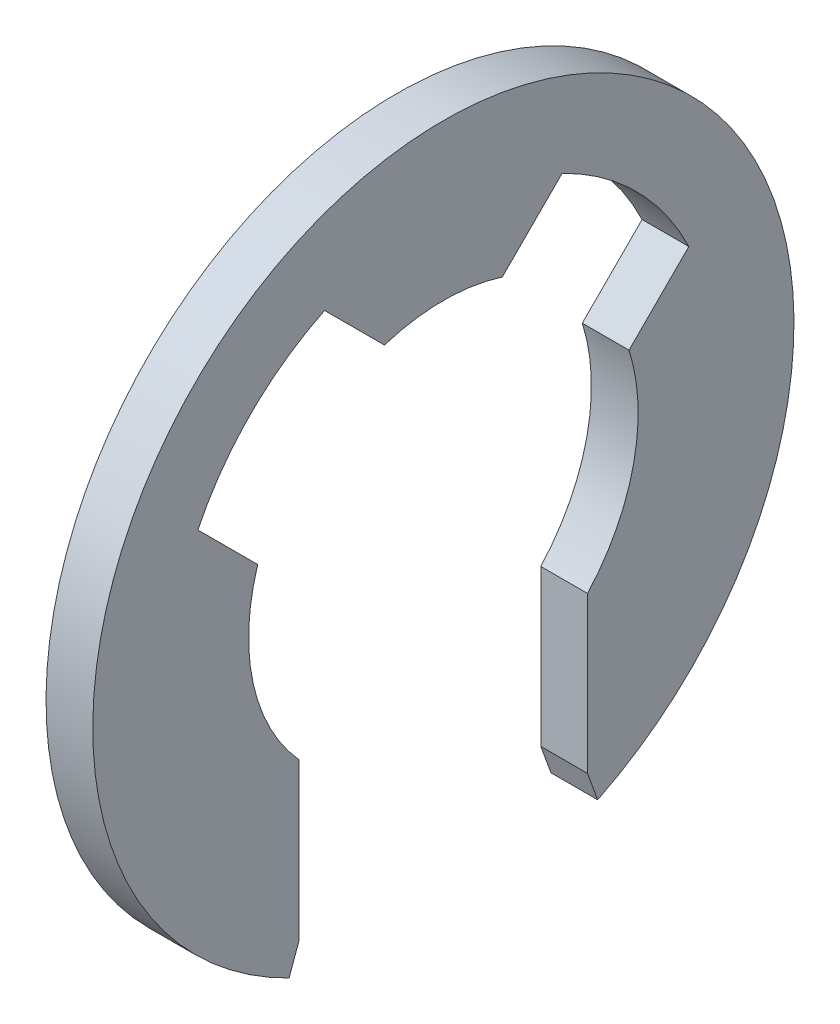
ISO-10303-21;
HEADER;
FILE_DESCRIPTION(('STEP AP214'),'2;1');
FILE_NAME('part.step','',(''),(''),'','','');
FILE_SCHEMA(('AUTOMOTIVE_DESIGN { 1 0 10303 214 1 1 1 1 }'));
ENDSEC;
DATA;
#1=APPLICATION_CONTEXT('core data for automotive mechanical design processes');
#2=APPLICATION_PROTOCOL_DEFINITION('international standard','automotive_design',2000,#1);
#3=PRODUCT_CONTEXT('',#1,'mechanical');
#4=PRODUCT('Part','Part','',(#3));
#5=PRODUCT_RELATED_PRODUCT_CATEGORY('part','',(#4));
#6=PRODUCT_DEFINITION_FORMATION('','',#4);
#7=PRODUCT_DEFINITION_CONTEXT('part definition',#1,'design');
#8=PRODUCT_DEFINITION('design','',#6,#7);
#9=PRODUCT_DEFINITION_SHAPE('','',#8);
#10=(LENGTH_UNIT() NAMED_UNIT(*) SI_UNIT(.MILLI.,.METRE.));
#11=(NAMED_UNIT(*) PLANE_ANGLE_UNIT() SI_UNIT($,.RADIAN.));
#12=(NAMED_UNIT(*) SI_UNIT($,.STERADIAN.) SOLID_ANGLE_UNIT());
#13=UNCERTAINTY_MEASURE_WITH_UNIT(LENGTH_MEASURE(1.E-05),#10,'distance_accuracy_value','');
#14=(GEOMETRIC_REPRESENTATION_CONTEXT(3) GLOBAL_UNCERTAINTY_ASSIGNED_CONTEXT((#13)) GLOBAL_UNIT_ASSIGNED_CONTEXT((#10,
#11,#12)) REPRESENTATION_CONTEXT('',''));
#15=CARTESIAN_POINT('',(0.,0.,0.));
#16=DIRECTION('',(0.,0.,1.));
#17=DIRECTION('',(1.,0.,0.));
#18=AXIS2_PLACEMENT_3D('',#15,#16,#17);
#19=CARTESIAN_POINT('',(0.6,0.,0.));
#20=DIRECTION('',(-1.,0.,0.));
#21=DIRECTION('',(0.,0.,1.));
#22=AXIS2_PLACEMENT_3D('',#19,#20,#21);
#23=CYLINDRICAL_SURFACE('',#22,4.5);
#24=CARTESIAN_POINT('',(0.6,0.,0.));
#25=DIRECTION('',(1.,0.,0.));
#26=DIRECTION('',(0.,0.,-1.));
#27=AXIS2_PLACEMENT_3D('',#24,#25,#26);
#28=CIRCLE('',#27,4.5);
#29=CARTESIAN_POINT('',(0.6,-4.04064170194528,-1.9807106392658));
#30=VERTEX_POINT('',#29);
#31=CARTESIAN_POINT('',(0.6,-4.04064170194528,1.9807106392658));
#32=VERTEX_POINT('',#31);
#33=EDGE_CURVE('E11',#30,#32,#28,.T.);
#34=ORIENTED_EDGE('',*,*,#33,.F.);
#35=DIRECTION('',(1.,0.,0.));
#36=VECTOR('',#35,1.);
#37=CARTESIAN_POINT('',(0.,-4.04064170194528,-1.9807106392658));
#38=LINE('',#37,#36);
#39=CARTESIAN_POINT('',(0.,-4.04064170194528,-1.9807106392658));
#40=VERTEX_POINT('',#39);
#41=EDGE_CURVE('E216',#40,#30,#38,.T.);
#42=ORIENTED_EDGE('',*,*,#41,.F.);
#43=CARTESIAN_POINT('',(0.,0.,0.));
#44=DIRECTION('',(1.,0.,0.));
#45=DIRECTION('',(0.,0.,-1.));
#46=AXIS2_PLACEMENT_3D('',#43,#44,#45);
#47=CIRCLE('',#46,4.5);
#48=CARTESIAN_POINT('',(0.,-4.04064170194528,1.9807106392658));
#49=VERTEX_POINT('',#48);
#50=EDGE_CURVE('E33',#40,#49,#47,.T.);
#51=ORIENTED_EDGE('',*,*,#50,.T.);
#52=DIRECTION('',(1.,0.,0.));
#53=VECTOR('',#52,1.);
#54=CARTESIAN_POINT('',(0.,-4.04064170194528,1.9807106392658));
#55=LINE('',#54,#53);
#56=EDGE_CURVE('E218',#49,#32,#55,.T.);
#57=ORIENTED_EDGE('',*,*,#56,.T.);
#58=EDGE_LOOP('',(#34,#42,#51,#57));
#59=FACE_BOUND('',#58,.T.);
#60=ADVANCED_FACE('F30',(#59),#23,.T.);
#61=CARTESIAN_POINT('',(0.6,0.,0.));
#62=DIRECTION('',(1.,0.,0.));
#63=DIRECTION('',(0.,0.,-1.));
#64=AXIS2_PLACEMENT_3D('',#61,#62,#63);
#65=PLANE('',#64);
#66=DIRECTION('',(0.,0.939692620785908,0.342020143325671));
#67=VECTOR('',#66,1.);
#68=CARTESIAN_POINT('',(0.6,-3.68151717208002,-1.85));
#69=LINE('',#68,#67);
#70=CARTESIAN_POINT('',(0.6,-3.68151717208002,-1.85));
#71=VERTEX_POINT('',#70);
#72=EDGE_CURVE('E174',#30,#71,#69,.T.);
#73=ORIENTED_EDGE('',*,*,#72,.F.);
#74=ORIENTED_EDGE('',*,*,#33,.T.);
#75=DIRECTION('',(0.,-0.939692620785907,0.342020143325673));
#76=VECTOR('',#75,1.);
#77=CARTESIAN_POINT('',(0.6,-3.68151717208002,1.85));
#78=LINE('',#77,#76);
#79=CARTESIAN_POINT('',(0.6,-3.68151717208002,1.85));
#80=VERTEX_POINT('',#79);
#81=EDGE_CURVE('E172',#80,#32,#78,.T.);
#82=ORIENTED_EDGE('',*,*,#81,.F.);
#83=DIRECTION('',(0.,-1.,0.));
#84=VECTOR('',#83,1.);
#85=CARTESIAN_POINT('',(0.6,-1.68151717208002,1.85));
#86=LINE('',#85,#84);
#87=CARTESIAN_POINT('',(0.6,-1.68151717208002,1.85));
#88=VERTEX_POINT('',#87);
#89=EDGE_CURVE('E169',#88,#80,#86,.T.);
#90=ORIENTED_EDGE('',*,*,#89,.F.);
#91=CARTESIAN_POINT('',(0.6,0.,0.));
#92=DIRECTION('',(1.,0.,0.));
#93=DIRECTION('',(0.,0.,-1.));
#94=AXIS2_PLACEMENT_3D('',#91,#92,#93);
#95=CIRCLE('',#94,2.5);
#96=CARTESIAN_POINT('',(0.6,0.75646091686971,2.38280651359875));
#97=VERTEX_POINT('',#96);
#98=EDGE_CURVE('E167',#97,#88,#95,.T.);
#99=ORIENTED_EDGE('',*,*,#98,.F.);
#100=DIRECTION('',(0.,-0.707106781186551,-0.707106781186545));
#101=VECTOR('',#100,1.);
#102=CARTESIAN_POINT('',(0.6,0.75646091686971,2.38280651359875));
#103=LINE('',#102,#101);
#104=CARTESIAN_POINT('',(0.6,1.52429377893665,3.15063937566568));
#105=VERTEX_POINT('',#104);
#106=EDGE_CURVE('E198',#105,#97,#103,.T.);
#107=ORIENTED_EDGE('',*,*,#106,.F.);
#108=CARTESIAN_POINT('',(0.6,0.,0.));
#109=DIRECTION('',(1.,0.,0.));
#110=DIRECTION('',(0.,0.,-1.));
#111=AXIS2_PLACEMENT_3D('',#108,#109,#110);
#112=CIRCLE('',#111,3.5);
#113=CARTESIAN_POINT('',(0.6,3.1506393756657,1.52429377893661));
#114=VERTEX_POINT('',#113);
#115=EDGE_CURVE('E196',#114,#105,#112,.T.);
#116=ORIENTED_EDGE('',*,*,#115,.F.);
#117=DIRECTION('',(0.,0.707106781186552,0.707106781186543));
#118=VECTOR('',#117,1.);
#119=CARTESIAN_POINT('',(0.6,2.38280651359876,0.756460916869684));
#120=LINE('',#119,#118);
#121=CARTESIAN_POINT('',(0.6,2.38280651359876,0.756460916869684));
#122=VERTEX_POINT('',#121);
#123=EDGE_CURVE('E142',#122,#114,#120,.T.);
#124=ORIENTED_EDGE('',*,*,#123,.F.);
#125=CARTESIAN_POINT('',(0.6,0.,0.));
#126=DIRECTION('',(1.,0.,0.));
#127=DIRECTION('',(0.,0.,-1.));
#128=AXIS2_PLACEMENT_3D('',#125,#126,#127);
#129=CIRCLE('',#128,2.5);
#130=CARTESIAN_POINT('',(0.6,2.38280651359876,-0.756460916869684));
#131=VERTEX_POINT('',#130);
#132=EDGE_CURVE('E192',#131,#122,#129,.T.);
#133=ORIENTED_EDGE('',*,*,#132,.F.);
#134=DIRECTION('',(0.,-0.707106781186553,0.707106781186543));
#135=VECTOR('',#134,1.);
#136=CARTESIAN_POINT('',(0.6,2.38280651359876,-0.756460916869684));
#137=LINE('',#136,#135);
#138=CARTESIAN_POINT('',(0.6,3.1506393756657,-1.52429377893661));
#139=VERTEX_POINT('',#138);
#140=EDGE_CURVE('E189',#139,#131,#137,.T.);
#141=ORIENTED_EDGE('',*,*,#140,.F.);
#142=CARTESIAN_POINT('',(0.6,0.,0.));
#143=DIRECTION('',(1.,0.,0.));
#144=DIRECTION('',(0.,0.,-1.));
#145=AXIS2_PLACEMENT_3D('',#142,#143,#144);
#146=CIRCLE('',#145,3.5);
#147=CARTESIAN_POINT('',(0.6,1.52429377893665,-3.15063937566568));
#148=VERTEX_POINT('',#147);
#149=EDGE_CURVE('E186',#148,#139,#146,.T.);
#150=ORIENTED_EDGE('',*,*,#149,.F.);
#151=DIRECTION('',(0.,0.707106781186551,-0.707106781186544));
#152=VECTOR('',#151,1.);
#153=CARTESIAN_POINT('',(0.6,0.75646091686971,-2.38280651359875));
#154=LINE('',#153,#152);
#155=CARTESIAN_POINT('',(0.6,0.75646091686971,-2.38280651359875));
#156=VERTEX_POINT('',#155);
#157=EDGE_CURVE('E183',#156,#148,#154,.T.);
#158=ORIENTED_EDGE('',*,*,#157,.F.);
#159=CARTESIAN_POINT('',(0.6,0.,0.));
#160=DIRECTION('',(1.,0.,0.));
#161=DIRECTION('',(0.,0.,-1.));
#162=AXIS2_PLACEMENT_3D('',#159,#160,#161);
#163=CIRCLE('',#162,2.5);
#164=CARTESIAN_POINT('',(0.6,-1.68151717208002,-1.85));
#165=VERTEX_POINT('',#164);
#166=EDGE_CURVE('E180',#165,#156,#163,.T.);
#167=ORIENTED_EDGE('',*,*,#166,.F.);
#168=DIRECTION('',(0.,1.,0.));
#169=VECTOR('',#168,1.);
#170=CARTESIAN_POINT('',(0.6,-1.68151717208002,-1.85));
#171=LINE('',#170,#169);
#172=EDGE_CURVE('E177',#71,#165,#171,.T.);
#173=ORIENTED_EDGE('',*,*,#172,.F.);
#174=EDGE_LOOP('',(#73,#74,#82,#90,#99,#107,#116,#124,#133,#141,#150,#158,#167,#173));
#175=FACE_BOUND('',#174,.T.);
#176=ADVANCED_FACE('F235',(#175),#65,.T.);
#177=CARTESIAN_POINT('',(0.,0.,0.));
#178=DIRECTION('',(1.,0.,0.));
#179=DIRECTION('',(0.,0.,-1.));
#180=AXIS2_PLACEMENT_3D('',#177,#178,#179);
#181=PLANE('',#180);
#182=ORIENTED_EDGE('',*,*,#50,.F.);
#183=DIRECTION('',(0.,0.939692620785908,0.342020143325671));
#184=VECTOR('',#183,1.);
#185=CARTESIAN_POINT('',(0.,-3.68151717208002,-1.85));
#186=LINE('',#185,#184);
#187=CARTESIAN_POINT('',(0.,-3.68151717208002,-1.85));
#188=VERTEX_POINT('',#187);
#189=EDGE_CURVE('E243',#40,#188,#186,.T.);
#190=ORIENTED_EDGE('',*,*,#189,.T.);
#191=DIRECTION('',(0.,1.,0.));
#192=VECTOR('',#191,1.);
#193=CARTESIAN_POINT('',(0.,-1.68151717208002,-1.85));
#194=LINE('',#193,#192);
#195=CARTESIAN_POINT('',(0.,-1.68151717208002,-1.85));
#196=VERTEX_POINT('',#195);
#197=EDGE_CURVE('E245',#188,#196,#194,.T.);
#198=ORIENTED_EDGE('',*,*,#197,.T.);
#199=CARTESIAN_POINT('',(0.,0.,0.));
#200=DIRECTION('',(1.,0.,0.));
#201=DIRECTION('',(0.,0.,-1.));
#202=AXIS2_PLACEMENT_3D('',#199,#200,#201);
#203=CIRCLE('',#202,2.5);
#204=CARTESIAN_POINT('',(0.,0.75646091686971,-2.38280651359875));
#205=VERTEX_POINT('',#204);
#206=EDGE_CURVE('E251',#196,#205,#203,.T.);
#207=ORIENTED_EDGE('',*,*,#206,.T.);
#208=DIRECTION('',(0.,0.707106781186551,-0.707106781186544));
#209=VECTOR('',#208,1.);
#210=CARTESIAN_POINT('',(0.,0.75646091686971,-2.38280651359875));
#211=LINE('',#210,#209);
#212=CARTESIAN_POINT('',(0.,1.52429377893665,-3.15063937566568));
#213=VERTEX_POINT('',#212);
#214=EDGE_CURVE('E254',#205,#213,#211,.T.);
#215=ORIENTED_EDGE('',*,*,#214,.T.);
#216=CARTESIAN_POINT('',(0.,0.,0.));
#217=DIRECTION('',(1.,0.,0.));
#218=DIRECTION('',(0.,0.,-1.));
#219=AXIS2_PLACEMENT_3D('',#216,#217,#218);
#220=CIRCLE('',#219,3.5);
#221=CARTESIAN_POINT('',(0.,3.1506393756657,-1.52429377893661));
#222=VERTEX_POINT('',#221);
#223=EDGE_CURVE('E257',#213,#222,#220,.T.);
#224=ORIENTED_EDGE('',*,*,#223,.T.);
#225=DIRECTION('',(0.,-0.707106781186553,0.707106781186543));
#226=VECTOR('',#225,1.);
#227=CARTESIAN_POINT('',(0.,2.38280651359876,-0.756460916869684));
#228=LINE('',#227,#226);
#229=CARTESIAN_POINT('',(0.,2.38280651359876,-0.756460916869684));
#230=VERTEX_POINT('',#229);
#231=EDGE_CURVE('E162',#222,#230,#228,.T.);
#232=ORIENTED_EDGE('',*,*,#231,.T.);
#233=CARTESIAN_POINT('',(0.,0.,0.));
#234=DIRECTION('',(1.,0.,0.));
#235=DIRECTION('',(0.,0.,-1.));
#236=AXIS2_PLACEMENT_3D('',#233,#234,#235);
#237=CIRCLE('',#236,2.5);
#238=CARTESIAN_POINT('',(0.,2.38280651359876,0.756460916869684));
#239=VERTEX_POINT('',#238);
#240=EDGE_CURVE('E160',#230,#239,#237,.T.);
#241=ORIENTED_EDGE('',*,*,#240,.T.);
#242=DIRECTION('',(0.,0.707106781186552,0.707106781186543));
#243=VECTOR('',#242,1.);
#244=CARTESIAN_POINT('',(0.,2.38280651359876,0.756460916869684));
#245=LINE('',#244,#243);
#246=CARTESIAN_POINT('',(0.,3.1506393756657,1.52429377893661));
#247=VERTEX_POINT('',#246);
#248=EDGE_CURVE('E139',#239,#247,#245,.T.);
#249=ORIENTED_EDGE('',*,*,#248,.T.);
#250=CARTESIAN_POINT('',(0.,0.,0.));
#251=DIRECTION('',(1.,0.,0.));
#252=DIRECTION('',(0.,0.,-1.));
#253=AXIS2_PLACEMENT_3D('',#250,#251,#252);
#254=CIRCLE('',#253,3.5);
#255=CARTESIAN_POINT('',(0.,1.52429377893665,3.15063937566568));
#256=VERTEX_POINT('',#255);
#257=EDGE_CURVE('E150',#247,#256,#254,.T.);
#258=ORIENTED_EDGE('',*,*,#257,.T.);
#259=DIRECTION('',(0.,-0.707106781186551,-0.707106781186545));
#260=VECTOR('',#259,1.);
#261=CARTESIAN_POINT('',(0.,0.75646091686971,2.38280651359875));
#262=LINE('',#261,#260);
#263=CARTESIAN_POINT('',(0.,0.75646091686971,2.38280651359875));
#264=VERTEX_POINT('',#263);
#265=EDGE_CURVE('E154',#256,#264,#262,.T.);
#266=ORIENTED_EDGE('',*,*,#265,.T.);
#267=CARTESIAN_POINT('',(0.,0.,0.));
#268=DIRECTION('',(1.,0.,0.));
#269=DIRECTION('',(0.,0.,-1.));
#270=AXIS2_PLACEMENT_3D('',#267,#268,#269);
#271=CIRCLE('',#270,2.5);
#272=CARTESIAN_POINT('',(0.,-1.68151717208002,1.85));
#273=VERTEX_POINT('',#272);
#274=EDGE_CURVE('E200',#264,#273,#271,.T.);
#275=ORIENTED_EDGE('',*,*,#274,.T.);
#276=DIRECTION('',(0.,-1.,0.));
#277=VECTOR('',#276,1.);
#278=CARTESIAN_POINT('',(0.,-1.68151717208002,1.85));
#279=LINE('',#278,#277);
#280=CARTESIAN_POINT('',(0.,-3.68151717208002,1.85));
#281=VERTEX_POINT('',#280);
#282=EDGE_CURVE('E228',#273,#281,#279,.T.);
#283=ORIENTED_EDGE('',*,*,#282,.T.);
#284=DIRECTION('',(0.,-0.939692620785907,0.342020143325673));
#285=VECTOR('',#284,1.);
#286=CARTESIAN_POINT('',(0.,-3.68151717208002,1.85));
#287=LINE('',#286,#285);
#288=EDGE_CURVE('E44',#281,#49,#287,.T.);
#289=ORIENTED_EDGE('',*,*,#288,.T.);
#290=EDGE_LOOP('',(#182,#190,#198,#207,#215,#224,#232,#241,#249,#258,#266,#275,#283,#289));
#291=FACE_BOUND('',#290,.T.);
#292=ADVANCED_FACE('F157',(#291),#181,.F.);
#293=CARTESIAN_POINT('',(0.,0.,0.));
#294=DIRECTION('',(1.,0.,0.));
#295=DIRECTION('',(0.,0.,-1.));
#296=AXIS2_PLACEMENT_3D('',#293,#294,#295);
#297=CYLINDRICAL_SURFACE('',#296,2.5);
#298=ORIENTED_EDGE('',*,*,#98,.T.);
#299=DIRECTION('',(1.,0.,0.));
#300=VECTOR('',#299,1.);
#301=CARTESIAN_POINT('',(0.,-1.68151717208002,1.85));
#302=LINE('',#301,#300);
#303=EDGE_CURVE('E104',#273,#88,#302,.T.);
#304=ORIENTED_EDGE('',*,*,#303,.F.);
#305=ORIENTED_EDGE('',*,*,#274,.F.);
#306=DIRECTION('',(1.,0.,0.));
#307=VECTOR('',#306,1.);
#308=CARTESIAN_POINT('',(0.,0.75646091686971,2.38280651359875));
#309=LINE('',#308,#307);
#310=EDGE_CURVE('E53',#264,#97,#309,.T.);
#311=ORIENTED_EDGE('',*,*,#310,.T.);
#312=EDGE_LOOP('',(#298,#304,#305,#311));
#313=FACE_BOUND('',#312,.T.);
#314=ADVANCED_FACE('F231',(#313),#297,.F.);
#315=CARTESIAN_POINT('',(0.,0.75646091686971,2.38280651359875));
#316=DIRECTION('',(0.,-0.707106781186545,0.70710678118655));
#317=DIRECTION('',(0.,-0.70710678118655,-0.707106781186545));
#318=AXIS2_PLACEMENT_3D('',#315,#316,#317);
#319=PLANE('',#318);
#320=ORIENTED_EDGE('',*,*,#106,.T.);
#321=ORIENTED_EDGE('',*,*,#310,.F.);
#322=ORIENTED_EDGE('',*,*,#265,.F.);
#323=DIRECTION('',(1.,0.,0.));
#324=VECTOR('',#323,1.);
#325=CARTESIAN_POINT('',(0.,1.52429377893665,3.15063937566568));
#326=LINE('',#325,#324);
#327=EDGE_CURVE('E146',#256,#105,#326,.T.);
#328=ORIENTED_EDGE('',*,*,#327,.T.);
#329=EDGE_LOOP('',(#320,#321,#322,#328));
#330=FACE_BOUND('',#329,.T.);
#331=ADVANCED_FACE('F267',(#330),#319,.F.);
#332=CARTESIAN_POINT('',(0.,0.,0.));
#333=DIRECTION('',(1.,0.,0.));
#334=DIRECTION('',(0.,0.,-1.));
#335=AXIS2_PLACEMENT_3D('',#332,#333,#334);
#336=CYLINDRICAL_SURFACE('',#335,3.5);
#337=ORIENTED_EDGE('',*,*,#115,.T.);
#338=ORIENTED_EDGE('',*,*,#327,.F.);
#339=ORIENTED_EDGE('',*,*,#257,.F.);
#340=DIRECTION('',(1.,0.,0.));
#341=VECTOR('',#340,1.);
#342=CARTESIAN_POINT('',(0.,3.1506393756657,1.52429377893661));
#343=LINE('',#342,#341);
#344=EDGE_CURVE('E135',#247,#114,#343,.T.);
#345=ORIENTED_EDGE('',*,*,#344,.T.);
#346=EDGE_LOOP('',(#337,#338,#339,#345));
#347=FACE_BOUND('',#346,.T.);
#348=ADVANCED_FACE('F151',(#347),#336,.F.);
#349=CARTESIAN_POINT('',(0.,2.38280651359876,0.756460916869684));
#350=DIRECTION('',(0.,0.707106781186543,-0.707106781186552));
#351=DIRECTION('',(0.,0.707106781186552,0.707106781186543));
#352=AXIS2_PLACEMENT_3D('',#349,#350,#351);
#353=PLANE('',#352);
#354=ORIENTED_EDGE('',*,*,#123,.T.);
#355=ORIENTED_EDGE('',*,*,#344,.F.);
#356=ORIENTED_EDGE('',*,*,#248,.F.);
#357=DIRECTION('',(1.,0.,0.));
#358=VECTOR('',#357,1.);
#359=CARTESIAN_POINT('',(0.,2.38280651359876,0.756460916869684));
#360=LINE('',#359,#358);
#361=EDGE_CURVE('E147',#239,#122,#360,.T.);
#362=ORIENTED_EDGE('',*,*,#361,.T.);
#363=EDGE_LOOP('',(#354,#355,#356,#362));
#364=FACE_BOUND('',#363,.T.);
#365=ADVANCED_FACE('F137',(#364),#353,.F.);
#366=CARTESIAN_POINT('',(0.,0.,0.));
#367=DIRECTION('',(1.,0.,0.));
#368=DIRECTION('',(0.,0.,-1.));
#369=AXIS2_PLACEMENT_3D('',#366,#367,#368);
#370=CYLINDRICAL_SURFACE('',#369,2.5);
#371=ORIENTED_EDGE('',*,*,#132,.T.);
#372=ORIENTED_EDGE('',*,*,#361,.F.);
#373=ORIENTED_EDGE('',*,*,#240,.F.);
#374=DIRECTION('',(1.,0.,0.));
#375=VECTOR('',#374,1.);
#376=CARTESIAN_POINT('',(0.,2.38280651359876,-0.756460916869684));
#377=LINE('',#376,#375);
#378=EDGE_CURVE('E204',#230,#131,#377,.T.);
#379=ORIENTED_EDGE('',*,*,#378,.T.);
#380=EDGE_LOOP('',(#371,#372,#373,#379));
#381=FACE_BOUND('',#380,.T.);
#382=ADVANCED_FACE('F266',(#381),#370,.F.);
#383=CARTESIAN_POINT('',(0.,2.38280651359876,-0.756460916869684));
#384=DIRECTION('',(0.,0.707106781186543,0.707106781186552));
#385=DIRECTION('',(0.,-0.707106781186552,0.707106781186543));
#386=AXIS2_PLACEMENT_3D('',#383,#384,#385);
#387=PLANE('',#386);
#388=ORIENTED_EDGE('',*,*,#140,.T.);
#389=ORIENTED_EDGE('',*,*,#378,.F.);
#390=ORIENTED_EDGE('',*,*,#231,.F.);
#391=DIRECTION('',(1.,0.,0.));
#392=VECTOR('',#391,1.);
#393=CARTESIAN_POINT('',(0.,3.1506393756657,-1.52429377893661));
#394=LINE('',#393,#392);
#395=EDGE_CURVE('E206',#222,#139,#394,.T.);
#396=ORIENTED_EDGE('',*,*,#395,.T.);
#397=EDGE_LOOP('',(#388,#389,#390,#396));
#398=FACE_BOUND('',#397,.T.);
#399=ADVANCED_FACE('F262',(#398),#387,.F.);
#400=CARTESIAN_POINT('',(0.,0.,0.));
#401=DIRECTION('',(1.,0.,0.));
#402=DIRECTION('',(0.,0.,-1.));
#403=AXIS2_PLACEMENT_3D('',#400,#401,#402);
#404=CYLINDRICAL_SURFACE('',#403,3.5);
#405=ORIENTED_EDGE('',*,*,#149,.T.);
#406=ORIENTED_EDGE('',*,*,#395,.F.);
#407=ORIENTED_EDGE('',*,*,#223,.F.);
#408=DIRECTION('',(1.,0.,0.));
#409=VECTOR('',#408,1.);
#410=CARTESIAN_POINT('',(0.,1.52429377893665,-3.15063937566568));
#411=LINE('',#410,#409);
#412=EDGE_CURVE('E208',#213,#148,#411,.T.);
#413=ORIENTED_EDGE('',*,*,#412,.T.);
#414=EDGE_LOOP('',(#405,#406,#407,#413));
#415=FACE_BOUND('',#414,.T.);
#416=ADVANCED_FACE('F304',(#415),#404,.F.);
#417=CARTESIAN_POINT('',(0.,0.75646091686971,-2.38280651359875));
#418=DIRECTION('',(0.,-0.707106781186544,-0.707106781186551));
#419=DIRECTION('',(0.,0.707106781186551,-0.707106781186544));
#420=AXIS2_PLACEMENT_3D('',#417,#418,#419);
#421=PLANE('',#420);
#422=ORIENTED_EDGE('',*,*,#157,.T.);
#423=ORIENTED_EDGE('',*,*,#412,.F.);
#424=ORIENTED_EDGE('',*,*,#214,.F.);
#425=DIRECTION('',(1.,0.,0.));
#426=VECTOR('',#425,1.);
#427=CARTESIAN_POINT('',(0.,0.75646091686971,-2.38280651359875));
#428=LINE('',#427,#426);
#429=EDGE_CURVE('E210',#205,#156,#428,.T.);
#430=ORIENTED_EDGE('',*,*,#429,.T.);
#431=EDGE_LOOP('',(#422,#423,#424,#430));
#432=FACE_BOUND('',#431,.T.);
#433=ADVANCED_FACE('F300',(#432),#421,.F.);
#434=CARTESIAN_POINT('',(0.,0.,0.));
#435=DIRECTION('',(1.,0.,0.));
#436=DIRECTION('',(0.,0.,-1.));
#437=AXIS2_PLACEMENT_3D('',#434,#435,#436);
#438=CYLINDRICAL_SURFACE('',#437,2.5);
#439=ORIENTED_EDGE('',*,*,#166,.T.);
#440=ORIENTED_EDGE('',*,*,#429,.F.);
#441=ORIENTED_EDGE('',*,*,#206,.F.);
#442=DIRECTION('',(1.,0.,0.));
#443=VECTOR('',#442,1.);
#444=CARTESIAN_POINT('',(0.,-1.68151717208002,-1.85));
#445=LINE('',#444,#443);
#446=EDGE_CURVE('E212',#196,#165,#445,.T.);
#447=ORIENTED_EDGE('',*,*,#446,.T.);
#448=EDGE_LOOP('',(#439,#440,#441,#447));
#449=FACE_BOUND('',#448,.T.);
#450=ADVANCED_FACE('F296',(#449),#438,.F.);
#451=CARTESIAN_POINT('',(0.,-1.68151717208002,-1.85));
#452=DIRECTION('',(0.,0.,-1.));
#453=DIRECTION('',(-1.,0.,0.));
#454=AXIS2_PLACEMENT_3D('',#451,#452,#453);
#455=PLANE('',#454);
#456=ORIENTED_EDGE('',*,*,#172,.T.);
#457=ORIENTED_EDGE('',*,*,#446,.F.);
#458=ORIENTED_EDGE('',*,*,#197,.F.);
#459=DIRECTION('',(1.,0.,0.));
#460=VECTOR('',#459,1.);
#461=CARTESIAN_POINT('',(0.,-3.68151717208002,-1.85));
#462=LINE('',#461,#460);
#463=EDGE_CURVE('E214',#188,#71,#462,.T.);
#464=ORIENTED_EDGE('',*,*,#463,.T.);
#465=EDGE_LOOP('',(#456,#457,#458,#464));
#466=FACE_BOUND('',#465,.T.);
#467=ADVANCED_FACE('F292',(#466),#455,.F.);
#468=CARTESIAN_POINT('',(0.,-3.68151717208002,-1.85));
#469=DIRECTION('',(0.,0.342020143325671,-0.939692620785908));
#470=DIRECTION('',(0.,0.939692620785908,0.342020143325671));
#471=AXIS2_PLACEMENT_3D('',#468,#469,#470);
#472=PLANE('',#471);
#473=ORIENTED_EDGE('',*,*,#72,.T.);
#474=ORIENTED_EDGE('',*,*,#463,.F.);
#475=ORIENTED_EDGE('',*,*,#189,.F.);
#476=ORIENTED_EDGE('',*,*,#41,.T.);
#477=EDGE_LOOP('',(#473,#474,#475,#476));
#478=FACE_BOUND('',#477,.T.);
#479=ADVANCED_FACE('F289',(#478),#472,.F.);
#480=CARTESIAN_POINT('',(0.,-3.68151717208002,1.85));
#481=DIRECTION('',(0.,0.342020143325673,0.939692620785907));
#482=DIRECTION('',(0.,-0.939692620785907,0.342020143325673));
#483=AXIS2_PLACEMENT_3D('',#480,#481,#482);
#484=PLANE('',#483);
#485=ORIENTED_EDGE('',*,*,#81,.T.);
#486=ORIENTED_EDGE('',*,*,#56,.F.);
#487=ORIENTED_EDGE('',*,*,#288,.F.);
#488=DIRECTION('',(1.,0.,0.));
#489=VECTOR('',#488,1.);
#490=CARTESIAN_POINT('',(0.,-3.68151717208002,1.85));
#491=LINE('',#490,#489);
#492=EDGE_CURVE('E221',#281,#80,#491,.T.);
#493=ORIENTED_EDGE('',*,*,#492,.T.);
#494=EDGE_LOOP('',(#485,#486,#487,#493));
#495=FACE_BOUND('',#494,.T.);
#496=ADVANCED_FACE('F237',(#495),#484,.F.);
#497=CARTESIAN_POINT('',(0.,-1.68151717208002,1.85));
#498=DIRECTION('',(0.,0.,1.));
#499=DIRECTION('',(0.,-1.,0.));
#500=AXIS2_PLACEMENT_3D('',#497,#498,#499);
#501=PLANE('',#500);
#502=ORIENTED_EDGE('',*,*,#89,.T.);
#503=ORIENTED_EDGE('',*,*,#492,.F.);
#504=ORIENTED_EDGE('',*,*,#282,.F.);
#505=ORIENTED_EDGE('',*,*,#303,.T.);
#506=EDGE_LOOP('',(#502,#503,#504,#505));
#507=FACE_BOUND('',#506,.T.);
#508=ADVANCED_FACE('F224',(#507),#501,.F.);
#509=CLOSED_SHELL('',(#60,#176,#292,#314,#331,#348,#365,#382,#399,#416,#433,#450,#467,#479,#496,#508));
#510=MANIFOLD_SOLID_BREP('B2',#509);
#511=ADVANCED_BREP_SHAPE_REPRESENTATION('',(#18,#510),#14);
#512=SHAPE_DEFINITION_REPRESENTATION(#9,#511);
ENDSEC;
END-ISO-10303-21;
